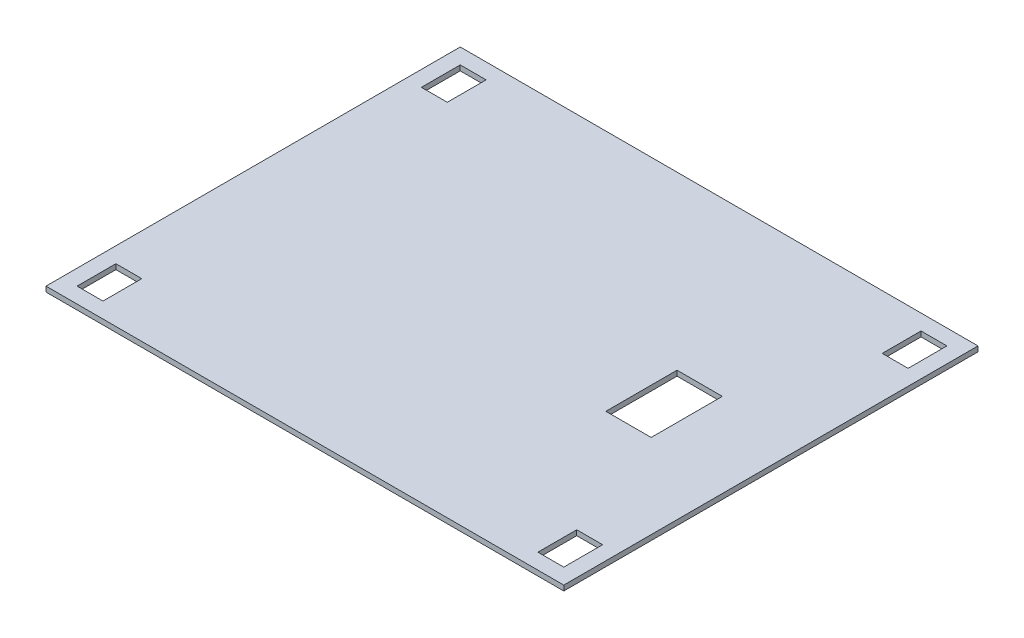
ISO-10303-21;
HEADER;
FILE_DESCRIPTION(('STEP AP214'),'2;1');
FILE_NAME('part.step','',(''),(''),'','','');
FILE_SCHEMA(('AUTOMOTIVE_DESIGN { 1 0 10303 214 1 1 1 1 }'));
ENDSEC;
DATA;
#1=APPLICATION_CONTEXT('core data for automotive mechanical design processes');
#2=APPLICATION_PROTOCOL_DEFINITION('international standard','automotive_design',2000,#1);
#3=PRODUCT_CONTEXT('',#1,'mechanical');
#4=PRODUCT('Part','Part','',(#3));
#5=PRODUCT_RELATED_PRODUCT_CATEGORY('part','',(#4));
#6=PRODUCT_DEFINITION_FORMATION('','',#4);
#7=PRODUCT_DEFINITION_CONTEXT('part definition',#1,'design');
#8=PRODUCT_DEFINITION('design','',#6,#7);
#9=PRODUCT_DEFINITION_SHAPE('','',#8);
#10=(LENGTH_UNIT() NAMED_UNIT(*) SI_UNIT(.MILLI.,.METRE.));
#11=(NAMED_UNIT(*) PLANE_ANGLE_UNIT() SI_UNIT($,.RADIAN.));
#12=(NAMED_UNIT(*) SI_UNIT($,.STERADIAN.) SOLID_ANGLE_UNIT());
#13=UNCERTAINTY_MEASURE_WITH_UNIT(LENGTH_MEASURE(1.E-05),#10,'distance_accuracy_value','');
#14=(GEOMETRIC_REPRESENTATION_CONTEXT(3) GLOBAL_UNCERTAINTY_ASSIGNED_CONTEXT((#13)) GLOBAL_UNIT_ASSIGNED_CONTEXT((#10,
#11,#12)) REPRESENTATION_CONTEXT('',''));
#15=CARTESIAN_POINT('',(0.,0.,0.));
#16=DIRECTION('',(0.,0.,1.));
#17=DIRECTION('',(1.,0.,0.));
#18=AXIS2_PLACEMENT_3D('',#15,#16,#17);
#19=CARTESIAN_POINT('',(-63.5,1.27,-50.8));
#20=DIRECTION('',(1.,0.,0.));
#21=DIRECTION('',(0.,0.,-1.));
#22=AXIS2_PLACEMENT_3D('',#19,#20,#21);
#23=PLANE('',#22);
#24=DIRECTION('',(0.,0.,1.));
#25=VECTOR('',#24,1.);
#26=CARTESIAN_POINT('',(-63.5,0.,-50.8));
#27=LINE('',#26,#25);
#28=CARTESIAN_POINT('',(-63.5,0.,-50.8));
#29=VERTEX_POINT('',#28);
#30=CARTESIAN_POINT('',(-63.5,0.,50.8));
#31=VERTEX_POINT('',#30);
#32=EDGE_CURVE('E360',#29,#31,#27,.T.);
#33=ORIENTED_EDGE('',*,*,#32,.T.);
#34=DIRECTION('',(0.,-1.,0.));
#35=VECTOR('',#34,1.);
#36=CARTESIAN_POINT('',(-63.5,1.27,50.8));
#37=LINE('',#36,#35);
#38=CARTESIAN_POINT('',(-63.5,1.27,50.8));
#39=VERTEX_POINT('',#38);
#40=EDGE_CURVE('E11',#39,#31,#37,.T.);
#41=ORIENTED_EDGE('',*,*,#40,.F.);
#42=DIRECTION('',(0.,0.,1.));
#43=VECTOR('',#42,1.);
#44=CARTESIAN_POINT('',(-63.5,1.27,-50.8));
#45=LINE('',#44,#43);
#46=CARTESIAN_POINT('',(-63.5,1.27,-50.8));
#47=VERTEX_POINT('',#46);
#48=EDGE_CURVE('E361',#47,#39,#45,.T.);
#49=ORIENTED_EDGE('',*,*,#48,.F.);
#50=DIRECTION('',(0.,-1.,0.));
#51=VECTOR('',#50,1.);
#52=CARTESIAN_POINT('',(-63.5,1.27,-50.8));
#53=LINE('',#52,#51);
#54=EDGE_CURVE('E371',#47,#29,#53,.T.);
#55=ORIENTED_EDGE('',*,*,#54,.T.);
#56=EDGE_LOOP('',(#33,#41,#49,#55));
#57=FACE_BOUND('',#56,.T.);
#58=ADVANCED_FACE('F40',(#57),#23,.F.);
#59=CARTESIAN_POINT('',(-63.5,1.27,50.8));
#60=DIRECTION('',(0.,0.,-1.));
#61=DIRECTION('',(-1.,0.,0.));
#62=AXIS2_PLACEMENT_3D('',#59,#60,#61);
#63=PLANE('',#62);
#64=DIRECTION('',(1.,0.,0.));
#65=VECTOR('',#64,1.);
#66=CARTESIAN_POINT('',(-63.5,0.,50.8));
#67=LINE('',#66,#65);
#68=CARTESIAN_POINT('',(63.5,0.,50.8));
#69=VERTEX_POINT('',#68);
#70=EDGE_CURVE('E374',#31,#69,#67,.T.);
#71=ORIENTED_EDGE('',*,*,#70,.T.);
#72=DIRECTION('',(0.,-1.,0.));
#73=VECTOR('',#72,1.);
#74=CARTESIAN_POINT('',(63.5,1.27,50.8));
#75=LINE('',#74,#73);
#76=CARTESIAN_POINT('',(63.5,1.27,50.8));
#77=VERTEX_POINT('',#76);
#78=EDGE_CURVE('E47',#77,#69,#75,.T.);
#79=ORIENTED_EDGE('',*,*,#78,.F.);
#80=DIRECTION('',(1.,0.,0.));
#81=VECTOR('',#80,1.);
#82=CARTESIAN_POINT('',(-63.5,1.27,50.8));
#83=LINE('',#82,#81);
#84=EDGE_CURVE('E364',#39,#77,#83,.T.);
#85=ORIENTED_EDGE('',*,*,#84,.F.);
#86=ORIENTED_EDGE('',*,*,#40,.T.);
#87=EDGE_LOOP('',(#71,#79,#85,#86));
#88=FACE_BOUND('',#87,.T.);
#89=ADVANCED_FACE('F403',(#88),#63,.F.);
#90=CARTESIAN_POINT('',(63.5,1.27,-50.8));
#91=DIRECTION('',(-1.,0.,0.));
#92=DIRECTION('',(0.,0.,1.));
#93=AXIS2_PLACEMENT_3D('',#90,#91,#92);
#94=PLANE('',#93);
#95=DIRECTION('',(0.,0.,-1.));
#96=VECTOR('',#95,1.);
#97=CARTESIAN_POINT('',(63.5,0.,-50.8));
#98=LINE('',#97,#96);
#99=CARTESIAN_POINT('',(63.5,0.,-50.8));
#100=VERTEX_POINT('',#99);
#101=EDGE_CURVE('E376',#69,#100,#98,.T.);
#102=ORIENTED_EDGE('',*,*,#101,.T.);
#103=DIRECTION('',(0.,-1.,0.));
#104=VECTOR('',#103,1.);
#105=CARTESIAN_POINT('',(63.5,1.27,-50.8));
#106=LINE('',#105,#104);
#107=CARTESIAN_POINT('',(63.5,1.27,-50.8));
#108=VERTEX_POINT('',#107);
#109=EDGE_CURVE('E381',#108,#100,#106,.T.);
#110=ORIENTED_EDGE('',*,*,#109,.F.);
#111=DIRECTION('',(0.,0.,-1.));
#112=VECTOR('',#111,1.);
#113=CARTESIAN_POINT('',(63.5,1.27,-50.8));
#114=LINE('',#113,#112);
#115=EDGE_CURVE('E367',#77,#108,#114,.T.);
#116=ORIENTED_EDGE('',*,*,#115,.F.);
#117=ORIENTED_EDGE('',*,*,#78,.T.);
#118=EDGE_LOOP('',(#102,#110,#116,#117));
#119=FACE_BOUND('',#118,.T.);
#120=ADVANCED_FACE('F388',(#119),#94,.F.);
#121=CARTESIAN_POINT('',(-63.5,1.27,-50.8));
#122=DIRECTION('',(0.,0.,1.));
#123=DIRECTION('',(1.,0.,0.));
#124=AXIS2_PLACEMENT_3D('',#121,#122,#123);
#125=PLANE('',#124);
#126=DIRECTION('',(-1.,0.,0.));
#127=VECTOR('',#126,1.);
#128=CARTESIAN_POINT('',(-63.5,0.,-50.8));
#129=LINE('',#128,#127);
#130=EDGE_CURVE('E365',#100,#29,#129,.T.);
#131=ORIENTED_EDGE('',*,*,#130,.T.);
#132=ORIENTED_EDGE('',*,*,#54,.F.);
#133=DIRECTION('',(-1.,0.,0.));
#134=VECTOR('',#133,1.);
#135=CARTESIAN_POINT('',(-63.5,1.27,-50.8));
#136=LINE('',#135,#134);
#137=EDGE_CURVE('E369',#108,#47,#136,.T.);
#138=ORIENTED_EDGE('',*,*,#137,.F.);
#139=ORIENTED_EDGE('',*,*,#109,.T.);
#140=EDGE_LOOP('',(#131,#132,#138,#139));
#141=FACE_BOUND('',#140,.T.);
#142=ADVANCED_FACE('F396',(#141),#125,.F.);
#143=CARTESIAN_POINT('',(0.,1.27,0.));
#144=DIRECTION('',(0.,1.,0.));
#145=DIRECTION('',(0.,0.,1.));
#146=AXIS2_PLACEMENT_3D('',#143,#144,#145);
#147=PLANE('',#146);
#148=DIRECTION('',(0.,0.,-1.));
#149=VECTOR('',#148,1.);
#150=CARTESIAN_POINT('',(42.8625,1.27,8.73124999999999));
#151=LINE('',#150,#149);
#152=CARTESIAN_POINT('',(42.8625,1.27,8.73124999999999));
#153=VERTEX_POINT('',#152);
#154=CARTESIAN_POINT('',(42.8625,1.27,-8.73125));
#155=VERTEX_POINT('',#154);
#156=EDGE_CURVE('E54',#153,#155,#151,.T.);
#157=ORIENTED_EDGE('',*,*,#156,.F.);
#158=DIRECTION('',(1.,0.,0.));
#159=VECTOR('',#158,1.);
#160=CARTESIAN_POINT('',(42.8625,1.27,8.73124999999999));
#161=LINE('',#160,#159);
#162=CARTESIAN_POINT('',(31.75,1.27,8.73125));
#163=VERTEX_POINT('',#162);
#164=EDGE_CURVE('E208',#163,#153,#161,.T.);
#165=ORIENTED_EDGE('',*,*,#164,.F.);
#166=DIRECTION('',(0.,0.,1.));
#167=VECTOR('',#166,1.);
#168=CARTESIAN_POINT('',(31.75,1.27,8.73125));
#169=LINE('',#168,#167);
#170=CARTESIAN_POINT('',(31.75,1.27,-8.73125));
#171=VERTEX_POINT('',#170);
#172=EDGE_CURVE('E228',#171,#163,#169,.T.);
#173=ORIENTED_EDGE('',*,*,#172,.F.);
#174=DIRECTION('',(-1.,0.,0.));
#175=VECTOR('',#174,1.);
#176=CARTESIAN_POINT('',(42.8625,1.27,-8.73125));
#177=LINE('',#176,#175);
#178=EDGE_CURVE('E222',#155,#171,#177,.T.);
#179=ORIENTED_EDGE('',*,*,#178,.F.);
#180=EDGE_LOOP('',(#157,#165,#173,#179));
#181=FACE_BOUND('',#180,.T.);
#182=DIRECTION('',(1.,0.,0.));
#183=VECTOR('',#182,1.);
#184=CARTESIAN_POINT('',(-59.69,1.27,46.99));
#185=LINE('',#184,#183);
#186=CARTESIAN_POINT('',(-59.69,1.27,46.99));
#187=VERTEX_POINT('',#186);
#188=CARTESIAN_POINT('',(-53.34,1.27,46.99));
#189=VERTEX_POINT('',#188);
#190=EDGE_CURVE('E308',#187,#189,#185,.T.);
#191=ORIENTED_EDGE('',*,*,#190,.F.);
#192=DIRECTION('',(0.,0.,1.));
#193=VECTOR('',#192,1.);
#194=CARTESIAN_POINT('',(-59.69,1.27,46.99));
#195=LINE('',#194,#193);
#196=CARTESIAN_POINT('',(-59.69,1.27,37.465));
#197=VERTEX_POINT('',#196);
#198=EDGE_CURVE('E316',#197,#187,#195,.T.);
#199=ORIENTED_EDGE('',*,*,#198,.F.);
#200=DIRECTION('',(-1.,0.,0.));
#201=VECTOR('',#200,1.);
#202=CARTESIAN_POINT('',(-59.69,1.27,37.465));
#203=LINE('',#202,#201);
#204=CARTESIAN_POINT('',(-53.34,1.27,37.465));
#205=VERTEX_POINT('',#204);
#206=EDGE_CURVE('E313',#205,#197,#203,.T.);
#207=ORIENTED_EDGE('',*,*,#206,.F.);
#208=DIRECTION('',(0.,0.,-1.));
#209=VECTOR('',#208,1.);
#210=CARTESIAN_POINT('',(-53.34,1.27,46.99));
#211=LINE('',#210,#209);
#212=EDGE_CURVE('E310',#189,#205,#211,.T.);
#213=ORIENTED_EDGE('',*,*,#212,.F.);
#214=EDGE_LOOP('',(#191,#199,#207,#213));
#215=FACE_BOUND('',#214,.T.);
#216=DIRECTION('',(0.,0.,-1.));
#217=VECTOR('',#216,1.);
#218=CARTESIAN_POINT('',(59.69,1.27,46.99));
#219=LINE('',#218,#217);
#220=CARTESIAN_POINT('',(59.69,1.27,46.99));
#221=VERTEX_POINT('',#220);
#222=CARTESIAN_POINT('',(59.69,1.27,37.465));
#223=VERTEX_POINT('',#222);
#224=EDGE_CURVE('E279',#221,#223,#219,.T.);
#225=ORIENTED_EDGE('',*,*,#224,.F.);
#226=DIRECTION('',(1.,0.,0.));
#227=VECTOR('',#226,1.);
#228=CARTESIAN_POINT('',(59.69,1.27,46.99));
#229=LINE('',#228,#227);
#230=CARTESIAN_POINT('',(53.34,1.27,46.99));
#231=VERTEX_POINT('',#230);
#232=EDGE_CURVE('E287',#231,#221,#229,.T.);
#233=ORIENTED_EDGE('',*,*,#232,.F.);
#234=DIRECTION('',(0.,0.,1.));
#235=VECTOR('',#234,1.);
#236=CARTESIAN_POINT('',(53.34,1.27,46.99));
#237=LINE('',#236,#235);
#238=CARTESIAN_POINT('',(53.34,1.27,37.465));
#239=VERTEX_POINT('',#238);
#240=EDGE_CURVE('E284',#239,#231,#237,.T.);
#241=ORIENTED_EDGE('',*,*,#240,.F.);
#242=DIRECTION('',(-1.,0.,0.));
#243=VECTOR('',#242,1.);
#244=CARTESIAN_POINT('',(59.69,1.27,37.465));
#245=LINE('',#244,#243);
#246=EDGE_CURVE('E281',#223,#239,#245,.T.);
#247=ORIENTED_EDGE('',*,*,#246,.F.);
#248=EDGE_LOOP('',(#225,#233,#241,#247));
#249=FACE_BOUND('',#248,.T.);
#250=DIRECTION('',(-1.,0.,0.));
#251=VECTOR('',#250,1.);
#252=CARTESIAN_POINT('',(59.69,1.27,-46.99));
#253=LINE('',#252,#251);
#254=CARTESIAN_POINT('',(59.69,1.27,-46.99));
#255=VERTEX_POINT('',#254);
#256=CARTESIAN_POINT('',(53.34,1.27,-46.99));
#257=VERTEX_POINT('',#256);
#258=EDGE_CURVE('E246',#255,#257,#253,.T.);
#259=ORIENTED_EDGE('',*,*,#258,.F.);
#260=DIRECTION('',(0.,0.,-1.));
#261=VECTOR('',#260,1.);
#262=CARTESIAN_POINT('',(59.69,1.27,-46.99));
#263=LINE('',#262,#261);
#264=CARTESIAN_POINT('',(59.69,1.27,-37.465));
#265=VERTEX_POINT('',#264);
#266=EDGE_CURVE('E254',#265,#255,#263,.T.);
#267=ORIENTED_EDGE('',*,*,#266,.F.);
#268=DIRECTION('',(1.,0.,0.));
#269=VECTOR('',#268,1.);
#270=CARTESIAN_POINT('',(59.69,1.27,-37.465));
#271=LINE('',#270,#269);
#272=CARTESIAN_POINT('',(53.34,1.27,-37.465));
#273=VERTEX_POINT('',#272);
#274=EDGE_CURVE('E251',#273,#265,#271,.T.);
#275=ORIENTED_EDGE('',*,*,#274,.F.);
#276=DIRECTION('',(0.,0.,1.));
#277=VECTOR('',#276,1.);
#278=CARTESIAN_POINT('',(53.34,1.27,-46.99));
#279=LINE('',#278,#277);
#280=EDGE_CURVE('E248',#257,#273,#279,.T.);
#281=ORIENTED_EDGE('',*,*,#280,.F.);
#282=EDGE_LOOP('',(#259,#267,#275,#281));
#283=FACE_BOUND('',#282,.T.);
#284=DIRECTION('',(0.,0.,1.));
#285=VECTOR('',#284,1.);
#286=CARTESIAN_POINT('',(-59.69,1.27,-46.99));
#287=LINE('',#286,#285);
#288=CARTESIAN_POINT('',(-59.69,1.27,-46.99));
#289=VERTEX_POINT('',#288);
#290=CARTESIAN_POINT('',(-59.69,1.27,-37.465));
#291=VERTEX_POINT('',#290);
#292=EDGE_CURVE('E337',#289,#291,#287,.T.);
#293=ORIENTED_EDGE('',*,*,#292,.F.);
#294=DIRECTION('',(-1.,0.,0.));
#295=VECTOR('',#294,1.);
#296=CARTESIAN_POINT('',(-59.69,1.27,-46.99));
#297=LINE('',#296,#295);
#298=CARTESIAN_POINT('',(-53.34,1.27,-46.99));
#299=VERTEX_POINT('',#298);
#300=EDGE_CURVE('E345',#299,#289,#297,.T.);
#301=ORIENTED_EDGE('',*,*,#300,.F.);
#302=DIRECTION('',(0.,0.,-1.));
#303=VECTOR('',#302,1.);
#304=CARTESIAN_POINT('',(-53.34,1.27,-46.99));
#305=LINE('',#304,#303);
#306=CARTESIAN_POINT('',(-53.34,1.27,-37.465));
#307=VERTEX_POINT('',#306);
#308=EDGE_CURVE('E342',#307,#299,#305,.T.);
#309=ORIENTED_EDGE('',*,*,#308,.F.);
#310=DIRECTION('',(1.,0.,0.));
#311=VECTOR('',#310,1.);
#312=CARTESIAN_POINT('',(-59.69,1.27,-37.465));
#313=LINE('',#312,#311);
#314=EDGE_CURVE('E339',#291,#307,#313,.T.);
#315=ORIENTED_EDGE('',*,*,#314,.F.);
#316=EDGE_LOOP('',(#293,#301,#309,#315));
#317=FACE_BOUND('',#316,.T.);
#318=ORIENTED_EDGE('',*,*,#48,.T.);
#319=ORIENTED_EDGE('',*,*,#84,.T.);
#320=ORIENTED_EDGE('',*,*,#115,.T.);
#321=ORIENTED_EDGE('',*,*,#137,.T.);
#322=EDGE_LOOP('',(#318,#319,#320,#321));
#323=FACE_BOUND('',#322,.T.);
#324=ADVANCED_FACE('F402',(#181,#215,#249,#283,#317,#323),#147,.T.);
#325=CARTESIAN_POINT('',(0.,0.,0.));
#326=DIRECTION('',(0.,1.,0.));
#327=DIRECTION('',(0.,0.,1.));
#328=AXIS2_PLACEMENT_3D('',#325,#326,#327);
#329=PLANE('',#328);
#330=DIRECTION('',(-1.,0.,0.));
#331=VECTOR('',#330,1.);
#332=CARTESIAN_POINT('',(42.8625,0.,8.73124999999999));
#333=LINE('',#332,#331);
#334=CARTESIAN_POINT('',(42.8625,0.,8.73124999999999));
#335=VERTEX_POINT('',#334);
#336=CARTESIAN_POINT('',(31.75,0.,8.73125));
#337=VERTEX_POINT('',#336);
#338=EDGE_CURVE('E220',#335,#337,#333,.T.);
#339=ORIENTED_EDGE('',*,*,#338,.F.);
#340=DIRECTION('',(0.,0.,1.));
#341=VECTOR('',#340,1.);
#342=CARTESIAN_POINT('',(42.8625,0.,8.73124999999999));
#343=LINE('',#342,#341);
#344=CARTESIAN_POINT('',(42.8625,0.,-8.73125));
#345=VERTEX_POINT('',#344);
#346=EDGE_CURVE('E202',#345,#335,#343,.T.);
#347=ORIENTED_EDGE('',*,*,#346,.F.);
#348=DIRECTION('',(1.,0.,0.));
#349=VECTOR('',#348,1.);
#350=CARTESIAN_POINT('',(42.8625,0.,-8.73125));
#351=LINE('',#350,#349);
#352=CARTESIAN_POINT('',(31.75,0.,-8.73125));
#353=VERTEX_POINT('',#352);
#354=EDGE_CURVE('E211',#353,#345,#351,.T.);
#355=ORIENTED_EDGE('',*,*,#354,.F.);
#356=DIRECTION('',(0.,0.,-1.));
#357=VECTOR('',#356,1.);
#358=CARTESIAN_POINT('',(31.75,0.,8.73125));
#359=LINE('',#358,#357);
#360=EDGE_CURVE('E62',#337,#353,#359,.T.);
#361=ORIENTED_EDGE('',*,*,#360,.F.);
#362=EDGE_LOOP('',(#339,#347,#355,#361));
#363=FACE_BOUND('',#362,.T.);
#364=DIRECTION('',(0.,0.,-1.));
#365=VECTOR('',#364,1.);
#366=CARTESIAN_POINT('',(-59.69,0.,46.99));
#367=LINE('',#366,#365);
#368=CARTESIAN_POINT('',(-59.69,0.,46.99));
#369=VERTEX_POINT('',#368);
#370=CARTESIAN_POINT('',(-59.69,0.,37.465));
#371=VERTEX_POINT('',#370);
#372=EDGE_CURVE('E302',#369,#371,#367,.T.);
#373=ORIENTED_EDGE('',*,*,#372,.F.);
#374=DIRECTION('',(-1.,0.,0.));
#375=VECTOR('',#374,1.);
#376=CARTESIAN_POINT('',(-59.69,0.,46.99));
#377=LINE('',#376,#375);
#378=CARTESIAN_POINT('',(-53.34,0.,46.99));
#379=VERTEX_POINT('',#378);
#380=EDGE_CURVE('E305',#379,#369,#377,.T.);
#381=ORIENTED_EDGE('',*,*,#380,.F.);
#382=DIRECTION('',(0.,0.,1.));
#383=VECTOR('',#382,1.);
#384=CARTESIAN_POINT('',(-53.34,0.,46.99));
#385=LINE('',#384,#383);
#386=CARTESIAN_POINT('',(-53.34,0.,37.465));
#387=VERTEX_POINT('',#386);
#388=EDGE_CURVE('E273',#387,#379,#385,.T.);
#389=ORIENTED_EDGE('',*,*,#388,.F.);
#390=DIRECTION('',(1.,0.,0.));
#391=VECTOR('',#390,1.);
#392=CARTESIAN_POINT('',(-59.69,0.,37.465));
#393=LINE('',#392,#391);
#394=EDGE_CURVE('E214',#371,#387,#393,.T.);
#395=ORIENTED_EDGE('',*,*,#394,.F.);
#396=EDGE_LOOP('',(#373,#381,#389,#395));
#397=FACE_BOUND('',#396,.T.);
#398=DIRECTION('',(-1.,0.,0.));
#399=VECTOR('',#398,1.);
#400=CARTESIAN_POINT('',(59.69,0.,46.99));
#401=LINE('',#400,#399);
#402=CARTESIAN_POINT('',(59.69,0.,46.99));
#403=VERTEX_POINT('',#402);
#404=CARTESIAN_POINT('',(53.34,0.,46.99));
#405=VERTEX_POINT('',#404);
#406=EDGE_CURVE('E272',#403,#405,#401,.T.);
#407=ORIENTED_EDGE('',*,*,#406,.F.);
#408=DIRECTION('',(0.,0.,1.));
#409=VECTOR('',#408,1.);
#410=CARTESIAN_POINT('',(59.69,0.,46.99));
#411=LINE('',#410,#409);
#412=CARTESIAN_POINT('',(59.69,0.,37.465));
#413=VERTEX_POINT('',#412);
#414=EDGE_CURVE('E276',#413,#403,#411,.T.);
#415=ORIENTED_EDGE('',*,*,#414,.F.);
#416=DIRECTION('',(1.,0.,0.));
#417=VECTOR('',#416,1.);
#418=CARTESIAN_POINT('',(59.69,0.,37.465));
#419=LINE('',#418,#417);
#420=CARTESIAN_POINT('',(53.34,0.,37.465));
#421=VERTEX_POINT('',#420);
#422=EDGE_CURVE('E240',#421,#413,#419,.T.);
#423=ORIENTED_EDGE('',*,*,#422,.F.);
#424=DIRECTION('',(0.,0.,-1.));
#425=VECTOR('',#424,1.);
#426=CARTESIAN_POINT('',(53.34,0.,46.99));
#427=LINE('',#426,#425);
#428=EDGE_CURVE('E270',#405,#421,#427,.T.);
#429=ORIENTED_EDGE('',*,*,#428,.F.);
#430=EDGE_LOOP('',(#407,#415,#423,#429));
#431=FACE_BOUND('',#430,.T.);
#432=DIRECTION('',(0.,0.,1.));
#433=VECTOR('',#432,1.);
#434=CARTESIAN_POINT('',(59.69,0.,-46.99));
#435=LINE('',#434,#433);
#436=CARTESIAN_POINT('',(59.69,0.,-46.99));
#437=VERTEX_POINT('',#436);
#438=CARTESIAN_POINT('',(59.69,0.,-37.465));
#439=VERTEX_POINT('',#438);
#440=EDGE_CURVE('E239',#437,#439,#435,.T.);
#441=ORIENTED_EDGE('',*,*,#440,.F.);
#442=DIRECTION('',(1.,0.,0.));
#443=VECTOR('',#442,1.);
#444=CARTESIAN_POINT('',(59.69,0.,-46.99));
#445=LINE('',#444,#443);
#446=CARTESIAN_POINT('',(53.34,0.,-46.99));
#447=VERTEX_POINT('',#446);
#448=EDGE_CURVE('E243',#447,#437,#445,.T.);
#449=ORIENTED_EDGE('',*,*,#448,.F.);
#450=DIRECTION('',(0.,0.,-1.));
#451=VECTOR('',#450,1.);
#452=CARTESIAN_POINT('',(53.34,0.,-46.99));
#453=LINE('',#452,#451);
#454=CARTESIAN_POINT('',(53.34,0.,-37.465));
#455=VERTEX_POINT('',#454);
#456=EDGE_CURVE('E260',#455,#447,#453,.T.);
#457=ORIENTED_EDGE('',*,*,#456,.F.);
#458=DIRECTION('',(-1.,0.,0.));
#459=VECTOR('',#458,1.);
#460=CARTESIAN_POINT('',(59.69,0.,-37.465));
#461=LINE('',#460,#459);
#462=EDGE_CURVE('E237',#439,#455,#461,.T.);
#463=ORIENTED_EDGE('',*,*,#462,.F.);
#464=EDGE_LOOP('',(#441,#449,#457,#463));
#465=FACE_BOUND('',#464,.T.);
#466=DIRECTION('',(1.,0.,0.));
#467=VECTOR('',#466,1.);
#468=CARTESIAN_POINT('',(-59.69,0.,-46.99));
#469=LINE('',#468,#467);
#470=CARTESIAN_POINT('',(-59.69,0.,-46.99));
#471=VERTEX_POINT('',#470);
#472=CARTESIAN_POINT('',(-53.34,0.,-46.99));
#473=VERTEX_POINT('',#472);
#474=EDGE_CURVE('E331',#471,#473,#469,.T.);
#475=ORIENTED_EDGE('',*,*,#474,.F.);
#476=DIRECTION('',(0.,0.,-1.));
#477=VECTOR('',#476,1.);
#478=CARTESIAN_POINT('',(-59.69,0.,-46.99));
#479=LINE('',#478,#477);
#480=CARTESIAN_POINT('',(-59.69,0.,-37.465));
#481=VERTEX_POINT('',#480);
#482=EDGE_CURVE('E334',#481,#471,#479,.T.);
#483=ORIENTED_EDGE('',*,*,#482,.F.);
#484=DIRECTION('',(-1.,0.,0.));
#485=VECTOR('',#484,1.);
#486=CARTESIAN_POINT('',(-59.69,0.,-37.465));
#487=LINE('',#486,#485);
#488=CARTESIAN_POINT('',(-53.34,0.,-37.465));
#489=VERTEX_POINT('',#488);
#490=EDGE_CURVE('E351',#489,#481,#487,.T.);
#491=ORIENTED_EDGE('',*,*,#490,.F.);
#492=DIRECTION('',(0.,0.,1.));
#493=VECTOR('',#492,1.);
#494=CARTESIAN_POINT('',(-53.34,0.,-46.99));
#495=LINE('',#494,#493);
#496=EDGE_CURVE('E269',#473,#489,#495,.T.);
#497=ORIENTED_EDGE('',*,*,#496,.F.);
#498=EDGE_LOOP('',(#475,#483,#491,#497));
#499=FACE_BOUND('',#498,.T.);
#500=ORIENTED_EDGE('',*,*,#32,.F.);
#501=ORIENTED_EDGE('',*,*,#130,.F.);
#502=ORIENTED_EDGE('',*,*,#101,.F.);
#503=ORIENTED_EDGE('',*,*,#70,.F.);
#504=EDGE_LOOP('',(#500,#501,#502,#503));
#505=FACE_BOUND('',#504,.T.);
#506=ADVANCED_FACE('F217',(#363,#397,#431,#465,#499,#505),#329,.F.);
#507=CARTESIAN_POINT('',(-59.69,-0.000999999999999916,-46.99));
#508=DIRECTION('',(-1.,0.,0.));
#509=DIRECTION('',(0.,0.,1.));
#510=AXIS2_PLACEMENT_3D('',#507,#508,#509);
#511=PLANE('',#510);
#512=ORIENTED_EDGE('',*,*,#482,.T.);
#513=DIRECTION('',(0.,1.,0.));
#514=VECTOR('',#513,1.);
#515=CARTESIAN_POINT('',(-59.69,-0.000999999999999916,-46.99));
#516=LINE('',#515,#514);
#517=EDGE_CURVE('E349',#471,#289,#516,.T.);
#518=ORIENTED_EDGE('',*,*,#517,.T.);
#519=ORIENTED_EDGE('',*,*,#292,.T.);
#520=DIRECTION('',(0.,1.,0.));
#521=VECTOR('',#520,1.);
#522=CARTESIAN_POINT('',(-59.69,-0.000999999999999916,-37.465));
#523=LINE('',#522,#521);
#524=EDGE_CURVE('E348',#481,#291,#523,.T.);
#525=ORIENTED_EDGE('',*,*,#524,.F.);
#526=EDGE_LOOP('',(#512,#518,#519,#525));
#527=FACE_BOUND('',#526,.T.);
#528=ADVANCED_FACE('F415',(#527),#511,.F.);
#529=CARTESIAN_POINT('',(-59.69,-0.000999999999999916,-46.99));
#530=DIRECTION('',(0.,0.,-1.));
#531=DIRECTION('',(-1.,0.,0.));
#532=AXIS2_PLACEMENT_3D('',#529,#530,#531);
#533=PLANE('',#532);
#534=ORIENTED_EDGE('',*,*,#474,.T.);
#535=DIRECTION('',(0.,1.,0.));
#536=VECTOR('',#535,1.);
#537=CARTESIAN_POINT('',(-53.34,-0.000999999999999916,-46.99));
#538=LINE('',#537,#536);
#539=EDGE_CURVE('E352',#473,#299,#538,.T.);
#540=ORIENTED_EDGE('',*,*,#539,.T.);
#541=ORIENTED_EDGE('',*,*,#300,.T.);
#542=ORIENTED_EDGE('',*,*,#517,.F.);
#543=EDGE_LOOP('',(#534,#540,#541,#542));
#544=FACE_BOUND('',#543,.T.);
#545=ADVANCED_FACE('F421',(#544),#533,.F.);
#546=CARTESIAN_POINT('',(-53.34,-0.000999999999999916,-46.99));
#547=DIRECTION('',(1.,0.,0.));
#548=DIRECTION('',(0.,0.,-1.));
#549=AXIS2_PLACEMENT_3D('',#546,#547,#548);
#550=PLANE('',#549);
#551=ORIENTED_EDGE('',*,*,#496,.T.);
#552=DIRECTION('',(0.,1.,0.));
#553=VECTOR('',#552,1.);
#554=CARTESIAN_POINT('',(-53.34,-0.000999999999999916,-37.465));
#555=LINE('',#554,#553);
#556=EDGE_CURVE('E354',#489,#307,#555,.T.);
#557=ORIENTED_EDGE('',*,*,#556,.T.);
#558=ORIENTED_EDGE('',*,*,#308,.T.);
#559=ORIENTED_EDGE('',*,*,#539,.F.);
#560=EDGE_LOOP('',(#551,#557,#558,#559));
#561=FACE_BOUND('',#560,.T.);
#562=ADVANCED_FACE('F427',(#561),#550,.F.);
#563=CARTESIAN_POINT('',(-59.69,-0.000999999999999916,-37.465));
#564=DIRECTION('',(0.,0.,1.));
#565=DIRECTION('',(1.,0.,0.));
#566=AXIS2_PLACEMENT_3D('',#563,#564,#565);
#567=PLANE('',#566);
#568=ORIENTED_EDGE('',*,*,#490,.T.);
#569=ORIENTED_EDGE('',*,*,#524,.T.);
#570=ORIENTED_EDGE('',*,*,#314,.T.);
#571=ORIENTED_EDGE('',*,*,#556,.F.);
#572=EDGE_LOOP('',(#568,#569,#570,#571));
#573=FACE_BOUND('',#572,.T.);
#574=ADVANCED_FACE('F423',(#573),#567,.F.);
#575=CARTESIAN_POINT('',(59.69,-0.000999999999999916,-46.99));
#576=DIRECTION('',(0.,0.,-1.));
#577=DIRECTION('',(-1.,0.,0.));
#578=AXIS2_PLACEMENT_3D('',#575,#576,#577);
#579=PLANE('',#578);
#580=ORIENTED_EDGE('',*,*,#448,.T.);
#581=DIRECTION('',(0.,1.,0.));
#582=VECTOR('',#581,1.);
#583=CARTESIAN_POINT('',(59.69,-0.000999999999999916,-46.99));
#584=LINE('',#583,#582);
#585=EDGE_CURVE('E258',#437,#255,#584,.T.);
#586=ORIENTED_EDGE('',*,*,#585,.T.);
#587=ORIENTED_EDGE('',*,*,#258,.T.);
#588=DIRECTION('',(0.,1.,0.));
#589=VECTOR('',#588,1.);
#590=CARTESIAN_POINT('',(53.34,-0.000999999999999916,-46.99));
#591=LINE('',#590,#589);
#592=EDGE_CURVE('E257',#447,#257,#591,.T.);
#593=ORIENTED_EDGE('',*,*,#592,.F.);
#594=EDGE_LOOP('',(#580,#586,#587,#593));
#595=FACE_BOUND('',#594,.T.);
#596=ADVANCED_FACE('F426',(#595),#579,.F.);
#597=CARTESIAN_POINT('',(59.69,-0.000999999999999916,-46.99));
#598=DIRECTION('',(1.,0.,0.));
#599=DIRECTION('',(0.,0.,-1.));
#600=AXIS2_PLACEMENT_3D('',#597,#598,#599);
#601=PLANE('',#600);
#602=ORIENTED_EDGE('',*,*,#440,.T.);
#603=DIRECTION('',(0.,1.,0.));
#604=VECTOR('',#603,1.);
#605=CARTESIAN_POINT('',(59.69,-0.000999999999999916,-37.465));
#606=LINE('',#605,#604);
#607=EDGE_CURVE('E261',#439,#265,#606,.T.);
#608=ORIENTED_EDGE('',*,*,#607,.T.);
#609=ORIENTED_EDGE('',*,*,#266,.T.);
#610=ORIENTED_EDGE('',*,*,#585,.F.);
#611=EDGE_LOOP('',(#602,#608,#609,#610));
#612=FACE_BOUND('',#611,.T.);
#613=ADVANCED_FACE('F470',(#612),#601,.F.);
#614=CARTESIAN_POINT('',(59.69,-0.000999999999999916,-37.465));
#615=DIRECTION('',(0.,0.,1.));
#616=DIRECTION('',(1.,0.,0.));
#617=AXIS2_PLACEMENT_3D('',#614,#615,#616);
#618=PLANE('',#617);
#619=ORIENTED_EDGE('',*,*,#462,.T.);
#620=DIRECTION('',(0.,1.,0.));
#621=VECTOR('',#620,1.);
#622=CARTESIAN_POINT('',(53.34,-0.000999999999999916,-37.465));
#623=LINE('',#622,#621);
#624=EDGE_CURVE('E263',#455,#273,#623,.T.);
#625=ORIENTED_EDGE('',*,*,#624,.T.);
#626=ORIENTED_EDGE('',*,*,#274,.T.);
#627=ORIENTED_EDGE('',*,*,#607,.F.);
#628=EDGE_LOOP('',(#619,#625,#626,#627));
#629=FACE_BOUND('',#628,.T.);
#630=ADVANCED_FACE('F474',(#629),#618,.F.);
#631=CARTESIAN_POINT('',(53.34,-0.000999999999999916,-46.99));
#632=DIRECTION('',(-1.,0.,0.));
#633=DIRECTION('',(0.,0.,1.));
#634=AXIS2_PLACEMENT_3D('',#631,#632,#633);
#635=PLANE('',#634);
#636=ORIENTED_EDGE('',*,*,#456,.T.);
#637=ORIENTED_EDGE('',*,*,#592,.T.);
#638=ORIENTED_EDGE('',*,*,#280,.T.);
#639=ORIENTED_EDGE('',*,*,#624,.F.);
#640=EDGE_LOOP('',(#636,#637,#638,#639));
#641=FACE_BOUND('',#640,.T.);
#642=ADVANCED_FACE('F456',(#641),#635,.F.);
#643=CARTESIAN_POINT('',(59.69,-0.000999999999999916,46.99));
#644=DIRECTION('',(1.,0.,0.));
#645=DIRECTION('',(0.,0.,-1.));
#646=AXIS2_PLACEMENT_3D('',#643,#644,#645);
#647=PLANE('',#646);
#648=ORIENTED_EDGE('',*,*,#414,.T.);
#649=DIRECTION('',(0.,1.,0.));
#650=VECTOR('',#649,1.);
#651=CARTESIAN_POINT('',(59.69,-0.000999999999999916,46.99));
#652=LINE('',#651,#650);
#653=EDGE_CURVE('E291',#403,#221,#652,.T.);
#654=ORIENTED_EDGE('',*,*,#653,.T.);
#655=ORIENTED_EDGE('',*,*,#224,.T.);
#656=DIRECTION('',(0.,1.,0.));
#657=VECTOR('',#656,1.);
#658=CARTESIAN_POINT('',(59.69,-0.000999999999999916,37.465));
#659=LINE('',#658,#657);
#660=EDGE_CURVE('E290',#413,#223,#659,.T.);
#661=ORIENTED_EDGE('',*,*,#660,.F.);
#662=EDGE_LOOP('',(#648,#654,#655,#661));
#663=FACE_BOUND('',#662,.T.);
#664=ADVANCED_FACE('F452',(#663),#647,.F.);
#665=CARTESIAN_POINT('',(59.69,-0.000999999999999916,46.99));
#666=DIRECTION('',(0.,0.,1.));
#667=DIRECTION('',(1.,0.,0.));
#668=AXIS2_PLACEMENT_3D('',#665,#666,#667);
#669=PLANE('',#668);
#670=ORIENTED_EDGE('',*,*,#406,.T.);
#671=DIRECTION('',(0.,1.,0.));
#672=VECTOR('',#671,1.);
#673=CARTESIAN_POINT('',(53.34,-0.000999999999999916,46.99));
#674=LINE('',#673,#672);
#675=EDGE_CURVE('E293',#405,#231,#674,.T.);
#676=ORIENTED_EDGE('',*,*,#675,.T.);
#677=ORIENTED_EDGE('',*,*,#232,.T.);
#678=ORIENTED_EDGE('',*,*,#653,.F.);
#679=EDGE_LOOP('',(#670,#676,#677,#678));
#680=FACE_BOUND('',#679,.T.);
#681=ADVANCED_FACE('F455',(#680),#669,.F.);
#682=CARTESIAN_POINT('',(53.34,-0.000999999999999916,46.99));
#683=DIRECTION('',(-1.,0.,0.));
#684=DIRECTION('',(0.,0.,1.));
#685=AXIS2_PLACEMENT_3D('',#682,#683,#684);
#686=PLANE('',#685);
#687=ORIENTED_EDGE('',*,*,#428,.T.);
#688=DIRECTION('',(0.,1.,0.));
#689=VECTOR('',#688,1.);
#690=CARTESIAN_POINT('',(53.34,-0.000999999999999916,37.465));
#691=LINE('',#690,#689);
#692=EDGE_CURVE('E295',#421,#239,#691,.T.);
#693=ORIENTED_EDGE('',*,*,#692,.T.);
#694=ORIENTED_EDGE('',*,*,#240,.T.);
#695=ORIENTED_EDGE('',*,*,#675,.F.);
#696=EDGE_LOOP('',(#687,#693,#694,#695));
#697=FACE_BOUND('',#696,.T.);
#698=ADVANCED_FACE('F460',(#697),#686,.F.);
#699=CARTESIAN_POINT('',(59.69,-0.000999999999999916,37.465));
#700=DIRECTION('',(0.,0.,-1.));
#701=DIRECTION('',(-1.,0.,0.));
#702=AXIS2_PLACEMENT_3D('',#699,#700,#701);
#703=PLANE('',#702);
#704=ORIENTED_EDGE('',*,*,#422,.T.);
#705=ORIENTED_EDGE('',*,*,#660,.T.);
#706=ORIENTED_EDGE('',*,*,#246,.T.);
#707=ORIENTED_EDGE('',*,*,#692,.F.);
#708=EDGE_LOOP('',(#704,#705,#706,#707));
#709=FACE_BOUND('',#708,.T.);
#710=ADVANCED_FACE('F439',(#709),#703,.F.);
#711=CARTESIAN_POINT('',(-59.69,-0.000999999999999916,46.99));
#712=DIRECTION('',(0.,0.,1.));
#713=DIRECTION('',(1.,0.,0.));
#714=AXIS2_PLACEMENT_3D('',#711,#712,#713);
#715=PLANE('',#714);
#716=ORIENTED_EDGE('',*,*,#380,.T.);
#717=DIRECTION('',(0.,1.,0.));
#718=VECTOR('',#717,1.);
#719=CARTESIAN_POINT('',(-59.69,-0.000999999999999916,46.99));
#720=LINE('',#719,#718);
#721=EDGE_CURVE('E320',#369,#187,#720,.T.);
#722=ORIENTED_EDGE('',*,*,#721,.T.);
#723=ORIENTED_EDGE('',*,*,#190,.T.);
#724=DIRECTION('',(0.,1.,0.));
#725=VECTOR('',#724,1.);
#726=CARTESIAN_POINT('',(-53.34,-0.000999999999999916,46.99));
#727=LINE('',#726,#725);
#728=EDGE_CURVE('E319',#379,#189,#727,.T.);
#729=ORIENTED_EDGE('',*,*,#728,.F.);
#730=EDGE_LOOP('',(#716,#722,#723,#729));
#731=FACE_BOUND('',#730,.T.);
#732=ADVANCED_FACE('F435',(#731),#715,.F.);
#733=CARTESIAN_POINT('',(-59.69,-0.000999999999999916,46.99));
#734=DIRECTION('',(-1.,0.,0.));
#735=DIRECTION('',(0.,0.,1.));
#736=AXIS2_PLACEMENT_3D('',#733,#734,#735);
#737=PLANE('',#736);
#738=ORIENTED_EDGE('',*,*,#372,.T.);
#739=DIRECTION('',(0.,1.,0.));
#740=VECTOR('',#739,1.);
#741=CARTESIAN_POINT('',(-59.69,-0.000999999999999916,37.465));
#742=LINE('',#741,#740);
#743=EDGE_CURVE('E322',#371,#197,#742,.T.);
#744=ORIENTED_EDGE('',*,*,#743,.T.);
#745=ORIENTED_EDGE('',*,*,#198,.T.);
#746=ORIENTED_EDGE('',*,*,#721,.F.);
#747=EDGE_LOOP('',(#738,#744,#745,#746));
#748=FACE_BOUND('',#747,.T.);
#749=ADVANCED_FACE('F438',(#748),#737,.F.);
#750=CARTESIAN_POINT('',(-59.69,-0.000999999999999916,37.465));
#751=DIRECTION('',(0.,0.,-1.));
#752=DIRECTION('',(-1.,0.,0.));
#753=AXIS2_PLACEMENT_3D('',#750,#751,#752);
#754=PLANE('',#753);
#755=ORIENTED_EDGE('',*,*,#394,.T.);
#756=DIRECTION('',(0.,1.,0.));
#757=VECTOR('',#756,1.);
#758=CARTESIAN_POINT('',(-53.34,-0.000999999999999916,37.465));
#759=LINE('',#758,#757);
#760=EDGE_CURVE('E324',#387,#205,#759,.T.);
#761=ORIENTED_EDGE('',*,*,#760,.T.);
#762=ORIENTED_EDGE('',*,*,#206,.T.);
#763=ORIENTED_EDGE('',*,*,#743,.F.);
#764=EDGE_LOOP('',(#755,#761,#762,#763));
#765=FACE_BOUND('',#764,.T.);
#766=ADVANCED_FACE('F444',(#765),#754,.F.);
#767=CARTESIAN_POINT('',(-53.34,-0.000999999999999916,46.99));
#768=DIRECTION('',(1.,0.,0.));
#769=DIRECTION('',(0.,0.,-1.));
#770=AXIS2_PLACEMENT_3D('',#767,#768,#769);
#771=PLANE('',#770);
#772=ORIENTED_EDGE('',*,*,#388,.T.);
#773=ORIENTED_EDGE('',*,*,#728,.T.);
#774=ORIENTED_EDGE('',*,*,#212,.T.);
#775=ORIENTED_EDGE('',*,*,#760,.F.);
#776=EDGE_LOOP('',(#772,#773,#774,#775));
#777=FACE_BOUND('',#776,.T.);
#778=ADVANCED_FACE('F441',(#777),#771,.F.);
#779=CARTESIAN_POINT('',(42.8625,-0.000999999999999916,8.73124999999999));
#780=DIRECTION('',(1.,0.,0.));
#781=DIRECTION('',(0.,0.,-1.));
#782=AXIS2_PLACEMENT_3D('',#779,#780,#781);
#783=PLANE('',#782);
#784=ORIENTED_EDGE('',*,*,#346,.T.);
#785=DIRECTION('',(0.,1.,0.));
#786=VECTOR('',#785,1.);
#787=CARTESIAN_POINT('',(42.8625,-0.000999999999999916,8.73124999999999));
#788=LINE('',#787,#786);
#789=EDGE_CURVE('E215',#335,#153,#788,.T.);
#790=ORIENTED_EDGE('',*,*,#789,.T.);
#791=ORIENTED_EDGE('',*,*,#156,.T.);
#792=DIRECTION('',(0.,1.,0.));
#793=VECTOR('',#792,1.);
#794=CARTESIAN_POINT('',(42.8625,-0.000999999999999916,-8.73125));
#795=LINE('',#794,#793);
#796=EDGE_CURVE('E198',#345,#155,#795,.T.);
#797=ORIENTED_EDGE('',*,*,#796,.F.);
#798=EDGE_LOOP('',(#784,#790,#791,#797));
#799=FACE_BOUND('',#798,.T.);
#800=ADVANCED_FACE('F200',(#799),#783,.F.);
#801=CARTESIAN_POINT('',(42.8625,-0.000999999999999916,8.73124999999999));
#802=DIRECTION('',(0.,0.,1.));
#803=DIRECTION('',(1.,0.,0.));
#804=AXIS2_PLACEMENT_3D('',#801,#802,#803);
#805=PLANE('',#804);
#806=ORIENTED_EDGE('',*,*,#338,.T.);
#807=DIRECTION('',(0.,1.,0.));
#808=VECTOR('',#807,1.);
#809=CARTESIAN_POINT('',(31.75,-0.000999999999999916,8.73125));
#810=LINE('',#809,#808);
#811=EDGE_CURVE('E234',#337,#163,#810,.T.);
#812=ORIENTED_EDGE('',*,*,#811,.T.);
#813=ORIENTED_EDGE('',*,*,#164,.T.);
#814=ORIENTED_EDGE('',*,*,#789,.F.);
#815=EDGE_LOOP('',(#806,#812,#813,#814));
#816=FACE_BOUND('',#815,.T.);
#817=ADVANCED_FACE('F484',(#816),#805,.F.);
#818=CARTESIAN_POINT('',(31.75,-0.000999999999999916,8.73125));
#819=DIRECTION('',(-1.,0.,0.));
#820=DIRECTION('',(0.,0.,1.));
#821=AXIS2_PLACEMENT_3D('',#818,#819,#820);
#822=PLANE('',#821);
#823=ORIENTED_EDGE('',*,*,#360,.T.);
#824=DIRECTION('',(0.,1.,0.));
#825=VECTOR('',#824,1.);
#826=CARTESIAN_POINT('',(31.75,-0.000999999999999916,-8.73125));
#827=LINE('',#826,#825);
#828=EDGE_CURVE('E207',#353,#171,#827,.T.);
#829=ORIENTED_EDGE('',*,*,#828,.T.);
#830=ORIENTED_EDGE('',*,*,#172,.T.);
#831=ORIENTED_EDGE('',*,*,#811,.F.);
#832=EDGE_LOOP('',(#823,#829,#830,#831));
#833=FACE_BOUND('',#832,.T.);
#834=ADVANCED_FACE('F487',(#833),#822,.F.);
#835=CARTESIAN_POINT('',(42.8625,-0.000999999999999916,-8.73125));
#836=DIRECTION('',(0.,0.,-1.));
#837=DIRECTION('',(-1.,0.,0.));
#838=AXIS2_PLACEMENT_3D('',#835,#836,#837);
#839=PLANE('',#838);
#840=ORIENTED_EDGE('',*,*,#354,.T.);
#841=ORIENTED_EDGE('',*,*,#796,.T.);
#842=ORIENTED_EDGE('',*,*,#178,.T.);
#843=ORIENTED_EDGE('',*,*,#828,.F.);
#844=EDGE_LOOP('',(#840,#841,#842,#843));
#845=FACE_BOUND('',#844,.T.);
#846=ADVANCED_FACE('F212',(#845),#839,.F.);
#847=CLOSED_SHELL('',(#58,#89,#120,#142,#324,#506,#528,#545,#562,#574,#596,#613,#630,#642,#664,
#681,#698,#710,#732,#749,#766,#778,#800,#817,#834,#846));
#848=MANIFOLD_SOLID_BREP('B2',#847);
#849=ADVANCED_BREP_SHAPE_REPRESENTATION('',(#18,#848),#14);
#850=SHAPE_DEFINITION_REPRESENTATION(#9,#849);
ENDSEC;
END-ISO-10303-21;
